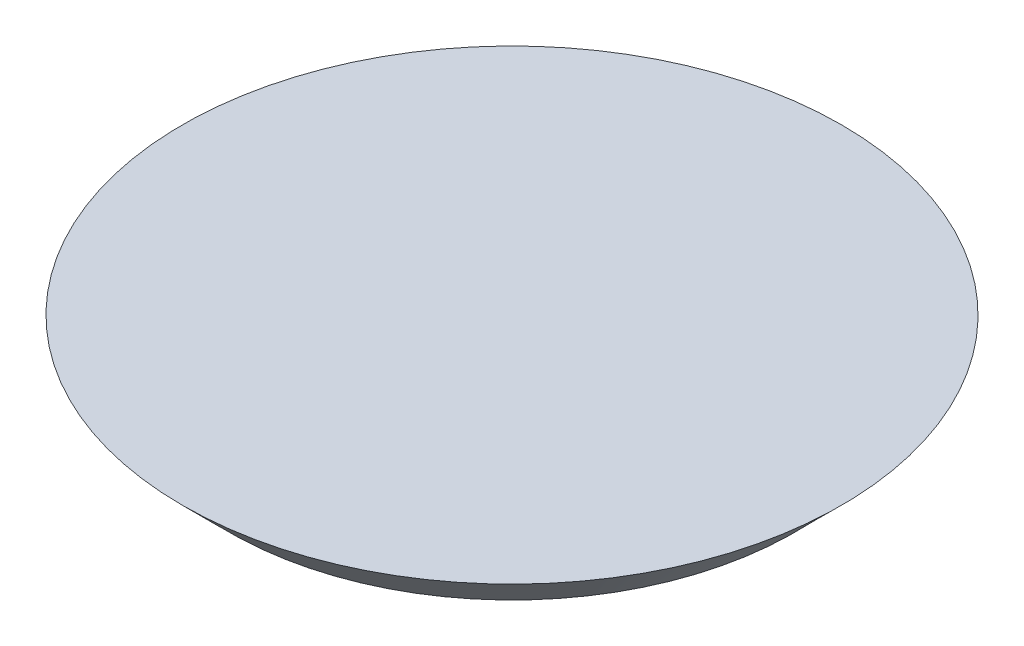
ISO-10303-21;
HEADER;
FILE_DESCRIPTION(('STEP AP214'),'2;1');
FILE_NAME('part.step','',(''),(''),'','','');
FILE_SCHEMA(('AUTOMOTIVE_DESIGN { 1 0 10303 214 1 1 1 1 }'));
ENDSEC;
DATA;
#1=APPLICATION_CONTEXT('core data for automotive mechanical design processes');
#2=APPLICATION_PROTOCOL_DEFINITION('international standard','automotive_design',2000,#1);
#3=PRODUCT_CONTEXT('',#1,'mechanical');
#4=PRODUCT('Part','Part','',(#3));
#5=PRODUCT_RELATED_PRODUCT_CATEGORY('part','',(#4));
#6=PRODUCT_DEFINITION_FORMATION('','',#4);
#7=PRODUCT_DEFINITION_CONTEXT('part definition',#1,'design');
#8=PRODUCT_DEFINITION('design','',#6,#7);
#9=PRODUCT_DEFINITION_SHAPE('','',#8);
#10=(LENGTH_UNIT() NAMED_UNIT(*) SI_UNIT(.MILLI.,.METRE.));
#11=(NAMED_UNIT(*) PLANE_ANGLE_UNIT() SI_UNIT($,.RADIAN.));
#12=(NAMED_UNIT(*) SI_UNIT($,.STERADIAN.) SOLID_ANGLE_UNIT());
#13=UNCERTAINTY_MEASURE_WITH_UNIT(LENGTH_MEASURE(1.E-05),#10,'distance_accuracy_value','');
#14=(GEOMETRIC_REPRESENTATION_CONTEXT(3) GLOBAL_UNCERTAINTY_ASSIGNED_CONTEXT((#13)) GLOBAL_UNIT_ASSIGNED_CONTEXT((#10,
#11,#12)) REPRESENTATION_CONTEXT('',''));
#15=CARTESIAN_POINT('',(0.,0.,0.));
#16=DIRECTION('',(0.,0.,1.));
#17=DIRECTION('',(1.,0.,0.));
#18=AXIS2_PLACEMENT_3D('',#15,#16,#17);
#19=CARTESIAN_POINT('',(0.,2.93896713615023,0.));
#20=DIRECTION('',(0.,1.,0.));
#21=DIRECTION('',(0.,0.,1.));
#22=AXIS2_PLACEMENT_3D('',#19,#20,#21);
#23=PLANE('',#22);
#24=CARTESIAN_POINT('',(0.,2.93896713615023,0.));
#25=DIRECTION('',(0.,-1.,0.));
#26=DIRECTION('',(0.,0.,-1.));
#27=AXIS2_PLACEMENT_3D('',#24,#25,#26);
#28=CIRCLE('',#27,7.);
#29=CARTESIAN_POINT('',(0.,2.93896713615023,-7.));
#30=VERTEX_POINT('',#29);
#31=EDGE_CURVE('E10',#30,#30,#28,.T.);
#32=ORIENTED_EDGE('',*,*,#31,.F.);
#33=EDGE_LOOP('',(#32));
#34=FACE_BOUND('',#33,.T.);
#35=ADVANCED_FACE('F32',(#34),#23,.T.);
#36=CARTESIAN_POINT('',(0.,1.93896713615023,0.));
#37=DIRECTION('',(0.,1.,0.));
#38=DIRECTION('',(0.,0.,1.));
#39=AXIS2_PLACEMENT_3D('',#36,#37,#38);
#40=CONICAL_SURFACE('',#39,6.,0.785398163397448);
#41=ORIENTED_EDGE('',*,*,#31,.T.);
#42=EDGE_LOOP('',(#41));
#43=FACE_BOUND('',#42,.T.);
#44=CARTESIAN_POINT('',(0.,1.93896713615023,0.));
#45=DIRECTION('',(0.,-1.,0.));
#46=DIRECTION('',(0.,0.,-1.));
#47=AXIS2_PLACEMENT_3D('',#44,#45,#46);
#48=CIRCLE('',#47,6.);
#49=CARTESIAN_POINT('',(0.,1.93896713615023,-6.));
#50=VERTEX_POINT('',#49);
#51=EDGE_CURVE('E38',#50,#50,#48,.T.);
#52=ORIENTED_EDGE('',*,*,#51,.F.);
#53=EDGE_LOOP('',(#52));
#54=FACE_BOUND('',#53,.T.);
#55=ADVANCED_FACE('F46',(#43,#54),#40,.T.);
#56=CARTESIAN_POINT('',(6.,1.93896713615023,0.));
#57=DIRECTION('',(0.,-1.,0.));
#58=DIRECTION('',(0.,0.,-1.));
#59=AXIS2_PLACEMENT_3D('',#56,#57,#58);
#60=PLANE('',#59);
#61=ORIENTED_EDGE('',*,*,#51,.T.);
#62=EDGE_LOOP('',(#61));
#63=FACE_BOUND('',#62,.T.);
#64=ADVANCED_FACE('F44',(#63),#60,.T.);
#65=CLOSED_SHELL('',(#35,#55,#64));
#66=MANIFOLD_SOLID_BREP('B2',#65);
#67=ADVANCED_BREP_SHAPE_REPRESENTATION('',(#18,#66),#14);
#68=SHAPE_DEFINITION_REPRESENTATION(#9,#67);
ENDSEC;
END-ISO-10303-21;
